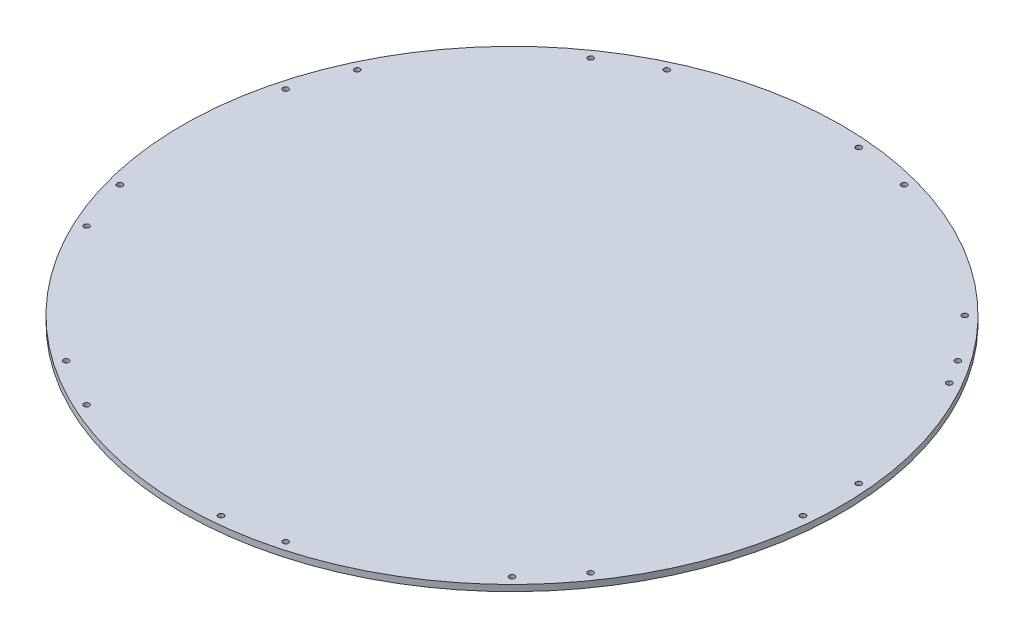
ISO-10303-21;
HEADER;
FILE_DESCRIPTION(('STEP AP214'),'2;1');
FILE_NAME('part.step','',(''),(''),'','','');
FILE_SCHEMA(('AUTOMOTIVE_DESIGN { 1 0 10303 214 1 1 1 1 }'));
ENDSEC;
DATA;
#1=APPLICATION_CONTEXT('core data for automotive mechanical design processes');
#2=APPLICATION_PROTOCOL_DEFINITION('international standard','automotive_design',2000,#1);
#3=PRODUCT_CONTEXT('',#1,'mechanical');
#4=PRODUCT('Part','Part','',(#3));
#5=PRODUCT_RELATED_PRODUCT_CATEGORY('part','',(#4));
#6=PRODUCT_DEFINITION_FORMATION('','',#4);
#7=PRODUCT_DEFINITION_CONTEXT('part definition',#1,'design');
#8=PRODUCT_DEFINITION('design','',#6,#7);
#9=PRODUCT_DEFINITION_SHAPE('','',#8);
#10=(LENGTH_UNIT() NAMED_UNIT(*) SI_UNIT(.MILLI.,.METRE.));
#11=(NAMED_UNIT(*) PLANE_ANGLE_UNIT() SI_UNIT($,.RADIAN.));
#12=(NAMED_UNIT(*) SI_UNIT($,.STERADIAN.) SOLID_ANGLE_UNIT());
#13=UNCERTAINTY_MEASURE_WITH_UNIT(LENGTH_MEASURE(1.E-05),#10,'distance_accuracy_value','');
#14=(GEOMETRIC_REPRESENTATION_CONTEXT(3) GLOBAL_UNCERTAINTY_ASSIGNED_CONTEXT((#13)) GLOBAL_UNIT_ASSIGNED_CONTEXT((#10,
#11,#12)) REPRESENTATION_CONTEXT('',''));
#15=CARTESIAN_POINT('',(0.,0.,0.));
#16=DIRECTION('',(0.,0.,1.));
#17=DIRECTION('',(1.,0.,0.));
#18=AXIS2_PLACEMENT_3D('',#15,#16,#17);
#19=CARTESIAN_POINT('',(0.,5.842,0.));
#20=DIRECTION('',(0.,-1.,0.));
#21=DIRECTION('',(0.,0.,-1.));
#22=AXIS2_PLACEMENT_3D('',#19,#20,#21);
#23=CYLINDRICAL_SURFACE('',#22,309.88);
#24=CARTESIAN_POINT('',(0.,5.842,0.));
#25=DIRECTION('',(0.,1.,0.));
#26=DIRECTION('',(0.,0.,1.));
#27=AXIS2_PLACEMENT_3D('',#24,#25,#26);
#28=CIRCLE('',#27,309.88);
#29=CARTESIAN_POINT('',(0.,5.842,309.88));
#30=VERTEX_POINT('',#29);
#31=EDGE_CURVE('E10',#30,#30,#28,.T.);
#32=ORIENTED_EDGE('',*,*,#31,.F.);
#33=EDGE_LOOP('',(#32));
#34=FACE_BOUND('',#33,.T.);
#35=CARTESIAN_POINT('',(0.,0.,0.));
#36=DIRECTION('',(0.,1.,0.));
#37=DIRECTION('',(0.,0.,1.));
#38=AXIS2_PLACEMENT_3D('',#35,#36,#37);
#39=CIRCLE('',#38,309.88);
#40=CARTESIAN_POINT('',(0.,0.,309.88));
#41=VERTEX_POINT('',#40);
#42=EDGE_CURVE('E33',#41,#41,#39,.T.);
#43=ORIENTED_EDGE('',*,*,#42,.T.);
#44=EDGE_LOOP('',(#43));
#45=FACE_BOUND('',#44,.T.);
#46=ADVANCED_FACE('F30',(#34,#45),#23,.T.);
#47=CARTESIAN_POINT('',(0.,5.842,0.));
#48=DIRECTION('',(0.,1.,0.));
#49=DIRECTION('',(0.,0.,1.));
#50=AXIS2_PLACEMENT_3D('',#47,#48,#49);
#51=PLANE('',#50);
#52=CARTESIAN_POINT('',(260.664986285079,5.842,-150.494999999999));
#53=DIRECTION('',(0.,1.,0.));
#54=DIRECTION('',(0.,0.,1.));
#55=AXIS2_PLACEMENT_3D('',#52,#53,#54);
#56=CIRCLE('',#55,2.55270000000004);
#57=CARTESIAN_POINT('',(260.664986285079,5.842,-147.942299999998));
#58=VERTEX_POINT('',#57);
#59=EDGE_CURVE('E150',#58,#58,#56,.T.);
#60=ORIENTED_EDGE('',*,*,#59,.F.);
#61=EDGE_LOOP('',(#60));
#62=FACE_BOUND('',#61,.T.);
#63=CARTESIAN_POINT('',(77.9019443854089,5.842,-290.734014454746));
#64=DIRECTION('',(0.,1.,0.));
#65=DIRECTION('',(-0.866025403784436,0.,-0.500000000000004));
#66=AXIS2_PLACEMENT_3D('',#63,#64,#65);
#67=CIRCLE('',#66,2.55270000000004);
#68=CARTESIAN_POINT('',(75.6912413371683,5.842,-292.010364454746));
#69=VERTEX_POINT('',#68);
#70=EDGE_CURVE('E91',#69,#69,#67,.T.);
#71=ORIENTED_EDGE('',*,*,#70,.F.);
#72=EDGE_LOOP('',(#71));
#73=FACE_BOUND('',#72,.T.);
#74=CARTESIAN_POINT('',(299.844642178635,5.842,-26.2330070096156));
#75=DIRECTION('',(0.,1.,0.));
#76=DIRECTION('',(-0.342020143325663,0.,-0.939692620785911));
#77=AXIS2_PLACEMENT_3D('',#74,#75,#76);
#78=CIRCLE('',#77,2.55270000000004);
#79=CARTESIAN_POINT('',(298.971567358767,5.842,-28.6317603626959));
#80=VERTEX_POINT('',#79);
#81=EDGE_CURVE('E84',#80,#80,#78,.T.);
#82=ORIENTED_EDGE('',*,*,#81,.F.);
#83=EDGE_LOOP('',(#82));
#84=FACE_BOUND('',#83,.T.);
#85=CARTESIAN_POINT('',(246.556573810545,5.842,-172.6407715773));
#86=DIRECTION('',(0.,1.,0.));
#87=DIRECTION('',(-0.342020143325663,0.,-0.939692620785911));
#88=AXIS2_PLACEMENT_3D('',#85,#86,#87);
#89=CIRCLE('',#88,2.55270000000004);
#90=CARTESIAN_POINT('',(245.683498990677,5.842,-175.03952493038));
#91=VERTEX_POINT('',#90);
#92=EDGE_CURVE('E103',#91,#91,#89,.T.);
#93=ORIENTED_EDGE('',*,*,#92,.F.);
#94=EDGE_LOOP('',(#93));
#95=FACE_BOUND('',#94,.T.);
#96=CARTESIAN_POINT('',(246.556573810542,5.842,172.640771577303));
#97=DIRECTION('',(0.,1.,0.));
#98=DIRECTION('',(0.342020143325676,0.,-0.939692620785906));
#99=AXIS2_PLACEMENT_3D('',#96,#97,#98);
#100=CIRCLE('',#99,2.55270000000004);
#101=CARTESIAN_POINT('',(247.42964863041,5.842,170.242018224223));
#102=VERTEX_POINT('',#101);
#103=EDGE_CURVE('E96',#102,#102,#100,.T.);
#104=ORIENTED_EDGE('',*,*,#103,.F.);
#105=EDGE_LOOP('',(#104));
#106=FACE_BOUND('',#105,.T.);
#107=CARTESIAN_POINT('',(-272.789580820161,5.842,-127.203870601333));
#108=DIRECTION('',(0.,1.,0.));
#109=DIRECTION('',(-0.642787609686541,0.,0.766044443118977));
#110=AXIS2_PLACEMENT_3D('',#107,#108,#109);
#111=CIRCLE('',#110,2.55270000000004);
#112=CARTESIAN_POINT('',(-274.430424751408,5.842,-125.248388951384));
#113=VERTEX_POINT('',#112);
#114=EDGE_CURVE('E67',#113,#113,#111,.T.);
#115=ORIENTED_EDGE('',*,*,#114,.F.);
#116=EDGE_LOOP('',(#115));
#117=FACE_BOUND('',#116,.T.);
#118=CARTESIAN_POINT('',(26.2330070096187,5.842,-299.844642178634));
#119=DIRECTION('',(0.,1.,0.));
#120=DIRECTION('',(-0.984807753012209,0.,0.173648177666927));
#121=AXIS2_PLACEMENT_3D('',#118,#119,#120);
#122=CIRCLE('',#121,2.55270000000004);
#123=CARTESIAN_POINT('',(23.7190882585044,5.842,-299.401370475504));
#124=VERTEX_POINT('',#123);
#125=EDGE_CURVE('E60',#124,#124,#122,.T.);
#126=ORIENTED_EDGE('',*,*,#125,.F.);
#127=EDGE_LOOP('',(#126));
#128=FACE_BOUND('',#127,.T.);
#129=CARTESIAN_POINT('',(-127.203870601332,5.842,-272.789580820162));
#130=DIRECTION('',(0.,1.,0.));
#131=DIRECTION('',(-0.984807753012209,0.,0.173648177666927));
#132=AXIS2_PLACEMENT_3D('',#129,#130,#131);
#133=CIRCLE('',#132,2.55270000000004);
#134=CARTESIAN_POINT('',(-129.717789352447,5.842,-272.346309117031));
#135=VERTEX_POINT('',#134);
#136=EDGE_CURVE('E79',#135,#135,#133,.T.);
#137=ORIENTED_EDGE('',*,*,#136,.F.);
#138=EDGE_LOOP('',(#137));
#139=FACE_BOUND('',#138,.T.);
#140=CARTESIAN_POINT('',(212.83207006934,5.842,-212.832070069338));
#141=DIRECTION('',(0.,1.,0.));
#142=DIRECTION('',(-0.866025403784436,0.,-0.500000000000004));
#143=AXIS2_PLACEMENT_3D('',#140,#141,#142);
#144=CIRCLE('',#143,2.55270000000004);
#145=CARTESIAN_POINT('',(210.6213670211,5.842,-214.108420069338));
#146=VERTEX_POINT('',#145);
#147=EDGE_CURVE('E72',#146,#146,#144,.T.);
#148=ORIENTED_EDGE('',*,*,#147,.F.);
#149=EDGE_LOOP('',(#148));
#150=FACE_BOUND('',#149,.T.);
#151=CARTESIAN_POINT('',(26.2330070096147,5.842,299.844642178635));
#152=DIRECTION('',(0.,1.,0.));
#153=DIRECTION('',(0.984807753012206,0.,0.17364817766694));
#154=AXIS2_PLACEMENT_3D('',#151,#152,#153);
#155=CIRCLE('',#154,2.55270000000004);
#156=CARTESIAN_POINT('',(28.746925760729,5.842,300.287913881765));
#157=VERTEX_POINT('',#156);
#158=EDGE_CURVE('E139',#157,#157,#155,.T.);
#159=ORIENTED_EDGE('',*,*,#158,.F.);
#160=EDGE_LOOP('',(#159));
#161=FACE_BOUND('',#160,.T.);
#162=CARTESIAN_POINT('',(-272.789580820163,5.842,127.20387060133));
#163=DIRECTION('',(0.,1.,0.));
#164=DIRECTION('',(0.64278760968653,0.,0.766044443118986));
#165=AXIS2_PLACEMENT_3D('',#162,#163,#164);
#166=CIRCLE('',#165,2.55270000000004);
#167=CARTESIAN_POINT('',(-271.148736888916,5.842,129.15935225128));
#168=VERTEX_POINT('',#167);
#169=EDGE_CURVE('E132',#168,#168,#166,.T.);
#170=ORIENTED_EDGE('',*,*,#169,.F.);
#171=EDGE_LOOP('',(#170));
#172=FACE_BOUND('',#171,.T.);
#173=CARTESIAN_POINT('',(-172.640771577304,5.842,246.556573810542));
#174=DIRECTION('',(0.,1.,0.));
#175=DIRECTION('',(0.64278760968653,0.,0.766044443118986));
#176=AXIS2_PLACEMENT_3D('',#173,#174,#175);
#177=CIRCLE('',#176,2.55270000000004);
#178=CARTESIAN_POINT('',(-170.999927646057,5.842,248.512055460492));
#179=VERTEX_POINT('',#178);
#180=EDGE_CURVE('E144',#179,#179,#177,.T.);
#181=ORIENTED_EDGE('',*,*,#180,.F.);
#182=EDGE_LOOP('',(#181));
#183=FACE_BOUND('',#182,.T.);
#184=CARTESIAN_POINT('',(299.844642178634,5.842,26.2330070096197));
#185=DIRECTION('',(0.,1.,0.));
#186=DIRECTION('',(0.342020143325676,0.,-0.939692620785906));
#187=AXIS2_PLACEMENT_3D('',#184,#185,#186);
#188=CIRCLE('',#187,2.55270000000004);
#189=CARTESIAN_POINT('',(300.717716998502,5.842,23.8342536565395));
#190=VERTEX_POINT('',#189);
#191=EDGE_CURVE('E115',#190,#190,#188,.T.);
#192=ORIENTED_EDGE('',*,*,#191,.F.);
#193=EDGE_LOOP('',(#192));
#194=FACE_BOUND('',#193,.T.);
#195=CARTESIAN_POINT('',(77.9019443854049,5.842,290.734014454747));
#196=DIRECTION('',(0.,1.,0.));
#197=DIRECTION('',(0.866025403784443,0.,-0.499999999999992));
#198=AXIS2_PLACEMENT_3D('',#195,#196,#197);
#199=CIRCLE('',#198,2.55270000000004);
#200=CARTESIAN_POINT('',(80.1126474336454,5.842,289.457664454747));
#201=VERTEX_POINT('',#200);
#202=EDGE_CURVE('E108',#201,#201,#199,.T.);
#203=ORIENTED_EDGE('',*,*,#202,.F.);
#204=EDGE_LOOP('',(#203));
#205=FACE_BOUND('',#204,.T.);
#206=CARTESIAN_POINT('',(212.832070069337,5.842,212.832070069341));
#207=DIRECTION('',(0.,1.,0.));
#208=DIRECTION('',(0.866025403784443,0.,-0.499999999999992));
#209=AXIS2_PLACEMENT_3D('',#206,#207,#208);
#210=CIRCLE('',#209,2.55270000000004);
#211=CARTESIAN_POINT('',(215.042773117578,5.842,211.555720069341));
#212=VERTEX_POINT('',#211);
#213=EDGE_CURVE('E127',#212,#212,#210,.T.);
#214=ORIENTED_EDGE('',*,*,#213,.F.);
#215=EDGE_LOOP('',(#214));
#216=FACE_BOUND('',#215,.T.);
#217=CARTESIAN_POINT('',(-127.203870601336,5.842,272.78958082016));
#218=DIRECTION('',(0.,1.,0.));
#219=DIRECTION('',(0.984807753012206,0.,0.17364817766694));
#220=AXIS2_PLACEMENT_3D('',#217,#218,#219);
#221=CIRCLE('',#220,2.55270000000004);
#222=CARTESIAN_POINT('',(-124.689951850222,5.842,273.23285252329));
#223=VERTEX_POINT('',#222);
#224=EDGE_CURVE('E120',#223,#223,#221,.T.);
#225=ORIENTED_EDGE('',*,*,#224,.F.);
#226=EDGE_LOOP('',(#225));
#227=FACE_BOUND('',#226,.T.);
#228=CARTESIAN_POINT('',(-172.640771577301,5.842,-246.556573810544));
#229=DIRECTION('',(0.,1.,0.));
#230=DIRECTION('',(-0.642787609686541,0.,0.766044443118977));
#231=AXIS2_PLACEMENT_3D('',#228,#229,#230);
#232=CIRCLE('',#231,2.55270000000004);
#233=CARTESIAN_POINT('',(-174.281615508548,5.842,-244.601092160594));
#234=VERTEX_POINT('',#233);
#235=EDGE_CURVE('E54',#234,#234,#232,.T.);
#236=ORIENTED_EDGE('',*,*,#235,.F.);
#237=EDGE_LOOP('',(#236));
#238=FACE_BOUND('',#237,.T.);
#239=CARTESIAN_POINT('',(-290.734014454747,5.842,-77.9019443854079));
#240=DIRECTION('',(0.,1.,0.));
#241=DIRECTION('',(0.,0.,1.));
#242=AXIS2_PLACEMENT_3D('',#239,#240,#241);
#243=CIRCLE('',#242,2.55270000000004);
#244=CARTESIAN_POINT('',(-290.734014454747,5.842,-75.3492443854079));
#245=VERTEX_POINT('',#244);
#246=EDGE_CURVE('E49',#245,#245,#243,.T.);
#247=ORIENTED_EDGE('',*,*,#246,.F.);
#248=EDGE_LOOP('',(#247));
#249=FACE_BOUND('',#248,.T.);
#250=CARTESIAN_POINT('',(-290.734014454747,5.842,77.9019443854079));
#251=DIRECTION('',(0.,1.,0.));
#252=DIRECTION('',(0.,0.,1.));
#253=AXIS2_PLACEMENT_3D('',#250,#251,#252);
#254=CIRCLE('',#253,2.55270000000004);
#255=CARTESIAN_POINT('',(-290.734014454747,5.842,80.4546443854079));
#256=VERTEX_POINT('',#255);
#257=EDGE_CURVE('E42',#256,#256,#254,.T.);
#258=ORIENTED_EDGE('',*,*,#257,.F.);
#259=EDGE_LOOP('',(#258));
#260=FACE_BOUND('',#259,.T.);
#261=ORIENTED_EDGE('',*,*,#31,.T.);
#262=EDGE_LOOP('',(#261));
#263=FACE_BOUND('',#262,.T.);
#264=ADVANCED_FACE('F166',(#62,#73,#84,#95,#106,#117,#128,#139,#150,#161,#172,#183,#194,#205,
#216,#227,#238,#249,#260,#263),#51,.T.);
#265=CARTESIAN_POINT('',(0.,0.,0.));
#266=DIRECTION('',(0.,1.,0.));
#267=DIRECTION('',(0.,0.,1.));
#268=AXIS2_PLACEMENT_3D('',#265,#266,#267);
#269=PLANE('',#268);
#270=CARTESIAN_POINT('',(260.664986285079,0.,-150.494999999999));
#271=DIRECTION('',(0.,1.,0.));
#272=DIRECTION('',(0.,0.,1.));
#273=AXIS2_PLACEMENT_3D('',#270,#271,#272);
#274=CIRCLE('',#273,2.55270000000004);
#275=CARTESIAN_POINT('',(260.664986285079,0.,-147.942299999998));
#276=VERTEX_POINT('',#275);
#277=EDGE_CURVE('E147',#276,#276,#274,.T.);
#278=ORIENTED_EDGE('',*,*,#277,.T.);
#279=EDGE_LOOP('',(#278));
#280=FACE_BOUND('',#279,.T.);
#281=CARTESIAN_POINT('',(77.9019443854089,0.,-290.734014454746));
#282=DIRECTION('',(0.,1.,0.));
#283=DIRECTION('',(-0.866025403784436,0.,-0.500000000000004));
#284=AXIS2_PLACEMENT_3D('',#281,#282,#283);
#285=CIRCLE('',#284,2.55270000000004);
#286=CARTESIAN_POINT('',(75.6912413371683,0.,-292.010364454746));
#287=VERTEX_POINT('',#286);
#288=EDGE_CURVE('E76',#287,#287,#285,.T.);
#289=ORIENTED_EDGE('',*,*,#288,.T.);
#290=EDGE_LOOP('',(#289));
#291=FACE_BOUND('',#290,.T.);
#292=CARTESIAN_POINT('',(299.844642178635,0.,-26.2330070096156));
#293=DIRECTION('',(0.,1.,0.));
#294=DIRECTION('',(-0.342020143325663,0.,-0.939692620785911));
#295=AXIS2_PLACEMENT_3D('',#292,#293,#294);
#296=CIRCLE('',#295,2.55270000000004);
#297=CARTESIAN_POINT('',(298.971567358767,0.,-28.6317603626959));
#298=VERTEX_POINT('',#297);
#299=EDGE_CURVE('E87',#298,#298,#296,.T.);
#300=ORIENTED_EDGE('',*,*,#299,.T.);
#301=EDGE_LOOP('',(#300));
#302=FACE_BOUND('',#301,.T.);
#303=CARTESIAN_POINT('',(246.556573810545,0.,-172.6407715773));
#304=DIRECTION('',(0.,1.,0.));
#305=DIRECTION('',(-0.342020143325663,0.,-0.939692620785911));
#306=AXIS2_PLACEMENT_3D('',#303,#304,#305);
#307=CIRCLE('',#306,2.55270000000004);
#308=CARTESIAN_POINT('',(245.683498990677,0.,-175.03952493038));
#309=VERTEX_POINT('',#308);
#310=EDGE_CURVE('E88',#309,#309,#307,.T.);
#311=ORIENTED_EDGE('',*,*,#310,.T.);
#312=EDGE_LOOP('',(#311));
#313=FACE_BOUND('',#312,.T.);
#314=CARTESIAN_POINT('',(246.556573810542,0.,172.640771577303));
#315=DIRECTION('',(0.,1.,0.));
#316=DIRECTION('',(0.342020143325676,0.,-0.939692620785906));
#317=AXIS2_PLACEMENT_3D('',#314,#315,#316);
#318=CIRCLE('',#317,2.55270000000004);
#319=CARTESIAN_POINT('',(247.42964863041,0.,170.242018224223));
#320=VERTEX_POINT('',#319);
#321=EDGE_CURVE('E99',#320,#320,#318,.T.);
#322=ORIENTED_EDGE('',*,*,#321,.T.);
#323=EDGE_LOOP('',(#322));
#324=FACE_BOUND('',#323,.T.);
#325=CARTESIAN_POINT('',(-272.789580820161,0.,-127.203870601333));
#326=DIRECTION('',(0.,1.,0.));
#327=DIRECTION('',(-0.642787609686541,0.,0.766044443118977));
#328=AXIS2_PLACEMENT_3D('',#325,#326,#327);
#329=CIRCLE('',#328,2.55270000000004);
#330=CARTESIAN_POINT('',(-274.430424751408,0.,-125.248388951384));
#331=VERTEX_POINT('',#330);
#332=EDGE_CURVE('E57',#331,#331,#329,.T.);
#333=ORIENTED_EDGE('',*,*,#332,.T.);
#334=EDGE_LOOP('',(#333));
#335=FACE_BOUND('',#334,.T.);
#336=CARTESIAN_POINT('',(26.2330070096187,0.,-299.844642178634));
#337=DIRECTION('',(0.,1.,0.));
#338=DIRECTION('',(-0.984807753012209,0.,0.173648177666927));
#339=AXIS2_PLACEMENT_3D('',#336,#337,#338);
#340=CIRCLE('',#339,2.55270000000004);
#341=CARTESIAN_POINT('',(23.7190882585044,0.,-299.401370475504));
#342=VERTEX_POINT('',#341);
#343=EDGE_CURVE('E63',#342,#342,#340,.T.);
#344=ORIENTED_EDGE('',*,*,#343,.T.);
#345=EDGE_LOOP('',(#344));
#346=FACE_BOUND('',#345,.T.);
#347=CARTESIAN_POINT('',(-127.203870601332,0.,-272.789580820162));
#348=DIRECTION('',(0.,1.,0.));
#349=DIRECTION('',(-0.984807753012209,0.,0.173648177666927));
#350=AXIS2_PLACEMENT_3D('',#347,#348,#349);
#351=CIRCLE('',#350,2.55270000000004);
#352=CARTESIAN_POINT('',(-129.717789352447,0.,-272.346309117031));
#353=VERTEX_POINT('',#352);
#354=EDGE_CURVE('E64',#353,#353,#351,.T.);
#355=ORIENTED_EDGE('',*,*,#354,.T.);
#356=EDGE_LOOP('',(#355));
#357=FACE_BOUND('',#356,.T.);
#358=CARTESIAN_POINT('',(212.83207006934,0.,-212.832070069338));
#359=DIRECTION('',(0.,1.,0.));
#360=DIRECTION('',(-0.866025403784436,0.,-0.500000000000004));
#361=AXIS2_PLACEMENT_3D('',#358,#359,#360);
#362=CIRCLE('',#361,2.55270000000004);
#363=CARTESIAN_POINT('',(210.6213670211,0.,-214.108420069338));
#364=VERTEX_POINT('',#363);
#365=EDGE_CURVE('E75',#364,#364,#362,.T.);
#366=ORIENTED_EDGE('',*,*,#365,.T.);
#367=EDGE_LOOP('',(#366));
#368=FACE_BOUND('',#367,.T.);
#369=CARTESIAN_POINT('',(26.2330070096147,0.,299.844642178635));
#370=DIRECTION('',(0.,1.,0.));
#371=DIRECTION('',(0.984807753012206,0.,0.17364817766694));
#372=AXIS2_PLACEMENT_3D('',#369,#370,#371);
#373=CIRCLE('',#372,2.55270000000004);
#374=CARTESIAN_POINT('',(28.746925760729,0.,300.287913881765));
#375=VERTEX_POINT('',#374);
#376=EDGE_CURVE('E124',#375,#375,#373,.T.);
#377=ORIENTED_EDGE('',*,*,#376,.T.);
#378=EDGE_LOOP('',(#377));
#379=FACE_BOUND('',#378,.T.);
#380=CARTESIAN_POINT('',(-272.789580820163,0.,127.20387060133));
#381=DIRECTION('',(0.,1.,0.));
#382=DIRECTION('',(0.64278760968653,0.,0.766044443118986));
#383=AXIS2_PLACEMENT_3D('',#380,#381,#382);
#384=CIRCLE('',#383,2.55270000000004);
#385=CARTESIAN_POINT('',(-271.148736888916,0.,129.15935225128));
#386=VERTEX_POINT('',#385);
#387=EDGE_CURVE('E135',#386,#386,#384,.T.);
#388=ORIENTED_EDGE('',*,*,#387,.T.);
#389=EDGE_LOOP('',(#388));
#390=FACE_BOUND('',#389,.T.);
#391=CARTESIAN_POINT('',(-172.640771577304,0.,246.556573810542));
#392=DIRECTION('',(0.,1.,0.));
#393=DIRECTION('',(0.64278760968653,0.,0.766044443118986));
#394=AXIS2_PLACEMENT_3D('',#391,#392,#393);
#395=CIRCLE('',#394,2.55270000000004);
#396=CARTESIAN_POINT('',(-170.999927646057,0.,248.512055460492));
#397=VERTEX_POINT('',#396);
#398=EDGE_CURVE('E136',#397,#397,#395,.T.);
#399=ORIENTED_EDGE('',*,*,#398,.T.);
#400=EDGE_LOOP('',(#399));
#401=FACE_BOUND('',#400,.T.);
#402=CARTESIAN_POINT('',(299.844642178634,0.,26.2330070096197));
#403=DIRECTION('',(0.,1.,0.));
#404=DIRECTION('',(0.342020143325676,0.,-0.939692620785906));
#405=AXIS2_PLACEMENT_3D('',#402,#403,#404);
#406=CIRCLE('',#405,2.55270000000004);
#407=CARTESIAN_POINT('',(300.717716998502,0.,23.8342536565395));
#408=VERTEX_POINT('',#407);
#409=EDGE_CURVE('E100',#408,#408,#406,.T.);
#410=ORIENTED_EDGE('',*,*,#409,.T.);
#411=EDGE_LOOP('',(#410));
#412=FACE_BOUND('',#411,.T.);
#413=CARTESIAN_POINT('',(77.9019443854049,0.,290.734014454747));
#414=DIRECTION('',(0.,1.,0.));
#415=DIRECTION('',(0.866025403784443,0.,-0.499999999999992));
#416=AXIS2_PLACEMENT_3D('',#413,#414,#415);
#417=CIRCLE('',#416,2.55270000000004);
#418=CARTESIAN_POINT('',(80.1126474336454,0.,289.457664454747));
#419=VERTEX_POINT('',#418);
#420=EDGE_CURVE('E111',#419,#419,#417,.T.);
#421=ORIENTED_EDGE('',*,*,#420,.T.);
#422=EDGE_LOOP('',(#421));
#423=FACE_BOUND('',#422,.T.);
#424=CARTESIAN_POINT('',(212.832070069337,0.,212.832070069341));
#425=DIRECTION('',(0.,1.,0.));
#426=DIRECTION('',(0.866025403784443,0.,-0.499999999999992));
#427=AXIS2_PLACEMENT_3D('',#424,#425,#426);
#428=CIRCLE('',#427,2.55270000000004);
#429=CARTESIAN_POINT('',(215.042773117578,0.,211.555720069341));
#430=VERTEX_POINT('',#429);
#431=EDGE_CURVE('E112',#430,#430,#428,.T.);
#432=ORIENTED_EDGE('',*,*,#431,.T.);
#433=EDGE_LOOP('',(#432));
#434=FACE_BOUND('',#433,.T.);
#435=CARTESIAN_POINT('',(-127.203870601336,0.,272.78958082016));
#436=DIRECTION('',(0.,1.,0.));
#437=DIRECTION('',(0.984807753012206,0.,0.17364817766694));
#438=AXIS2_PLACEMENT_3D('',#435,#436,#437);
#439=CIRCLE('',#438,2.55270000000004);
#440=CARTESIAN_POINT('',(-124.689951850222,0.,273.23285252329));
#441=VERTEX_POINT('',#440);
#442=EDGE_CURVE('E123',#441,#441,#439,.T.);
#443=ORIENTED_EDGE('',*,*,#442,.T.);
#444=EDGE_LOOP('',(#443));
#445=FACE_BOUND('',#444,.T.);
#446=CARTESIAN_POINT('',(-172.640771577301,0.,-246.556573810544));
#447=DIRECTION('',(0.,1.,0.));
#448=DIRECTION('',(-0.642787609686541,0.,0.766044443118977));
#449=AXIS2_PLACEMENT_3D('',#446,#447,#448);
#450=CIRCLE('',#449,2.55270000000004);
#451=CARTESIAN_POINT('',(-174.281615508548,0.,-244.601092160594));
#452=VERTEX_POINT('',#451);
#453=EDGE_CURVE('E46',#452,#452,#450,.T.);
#454=ORIENTED_EDGE('',*,*,#453,.T.);
#455=EDGE_LOOP('',(#454));
#456=FACE_BOUND('',#455,.T.);
#457=CARTESIAN_POINT('',(-290.734014454747,0.,-77.9019443854079));
#458=DIRECTION('',(0.,1.,0.));
#459=DIRECTION('',(0.,0.,1.));
#460=AXIS2_PLACEMENT_3D('',#457,#458,#459);
#461=CIRCLE('',#460,2.55270000000004);
#462=CARTESIAN_POINT('',(-290.734014454747,0.,-75.3492443854079));
#463=VERTEX_POINT('',#462);
#464=EDGE_CURVE('E40',#463,#463,#461,.T.);
#465=ORIENTED_EDGE('',*,*,#464,.T.);
#466=EDGE_LOOP('',(#465));
#467=FACE_BOUND('',#466,.T.);
#468=CARTESIAN_POINT('',(-290.734014454747,0.,77.9019443854079));
#469=DIRECTION('',(0.,1.,0.));
#470=DIRECTION('',(0.,0.,1.));
#471=AXIS2_PLACEMENT_3D('',#468,#469,#470);
#472=CIRCLE('',#471,2.55270000000004);
#473=CARTESIAN_POINT('',(-290.734014454747,0.,80.4546443854079));
#474=VERTEX_POINT('',#473);
#475=EDGE_CURVE('E45',#474,#474,#472,.T.);
#476=ORIENTED_EDGE('',*,*,#475,.T.);
#477=EDGE_LOOP('',(#476));
#478=FACE_BOUND('',#477,.T.);
#479=ORIENTED_EDGE('',*,*,#42,.F.);
#480=EDGE_LOOP('',(#479));
#481=FACE_BOUND('',#480,.T.);
#482=ADVANCED_FACE('F156',(#280,#291,#302,#313,#324,#335,#346,#357,#368,#379,#390,#401,#412,
#423,#434,#445,#456,#467,#478,#481),#269,.F.);
#483=CARTESIAN_POINT('',(-290.734014454747,0.,77.9019443854079));
#484=DIRECTION('',(0.,1.,0.));
#485=DIRECTION('',(0.,0.,1.));
#486=AXIS2_PLACEMENT_3D('',#483,#484,#485);
#487=CYLINDRICAL_SURFACE('',#486,2.55270000000004);
#488=ORIENTED_EDGE('',*,*,#475,.F.);
#489=EDGE_LOOP('',(#488));
#490=FACE_BOUND('',#489,.T.);
#491=ORIENTED_EDGE('',*,*,#257,.T.);
#492=EDGE_LOOP('',(#491));
#493=FACE_BOUND('',#492,.T.);
#494=ADVANCED_FACE('F206',(#490,#493),#487,.F.);
#495=CARTESIAN_POINT('',(-290.734014454747,0.,-77.9019443854079));
#496=DIRECTION('',(0.,1.,0.));
#497=DIRECTION('',(0.,0.,1.));
#498=AXIS2_PLACEMENT_3D('',#495,#496,#497);
#499=CYLINDRICAL_SURFACE('',#498,2.55270000000004);
#500=ORIENTED_EDGE('',*,*,#464,.F.);
#501=EDGE_LOOP('',(#500));
#502=FACE_BOUND('',#501,.T.);
#503=ORIENTED_EDGE('',*,*,#246,.T.);
#504=EDGE_LOOP('',(#503));
#505=FACE_BOUND('',#504,.T.);
#506=ADVANCED_FACE('F208',(#502,#505),#499,.F.);
#507=CARTESIAN_POINT('',(-172.640771577301,0.,-246.556573810544));
#508=DIRECTION('',(0.,1.,0.));
#509=DIRECTION('',(0.,0.,1.));
#510=AXIS2_PLACEMENT_3D('',#507,#508,#509);
#511=CYLINDRICAL_SURFACE('',#510,2.55270000000004);
#512=ORIENTED_EDGE('',*,*,#453,.F.);
#513=EDGE_LOOP('',(#512));
#514=FACE_BOUND('',#513,.T.);
#515=ORIENTED_EDGE('',*,*,#235,.T.);
#516=EDGE_LOOP('',(#515));
#517=FACE_BOUND('',#516,.T.);
#518=ADVANCED_FACE('F215',(#514,#517),#511,.F.);
#519=CARTESIAN_POINT('',(-127.203870601336,0.,272.78958082016));
#520=DIRECTION('',(0.,1.,0.));
#521=DIRECTION('',(0.,0.,1.));
#522=AXIS2_PLACEMENT_3D('',#519,#520,#521);
#523=CYLINDRICAL_SURFACE('',#522,2.55270000000004);
#524=ORIENTED_EDGE('',*,*,#442,.F.);
#525=EDGE_LOOP('',(#524));
#526=FACE_BOUND('',#525,.T.);
#527=ORIENTED_EDGE('',*,*,#224,.T.);
#528=EDGE_LOOP('',(#527));
#529=FACE_BOUND('',#528,.T.);
#530=ADVANCED_FACE('F353',(#526,#529),#523,.F.);
#531=CARTESIAN_POINT('',(212.832070069337,0.,212.832070069341));
#532=DIRECTION('',(0.,1.,0.));
#533=DIRECTION('',(0.,0.,1.));
#534=AXIS2_PLACEMENT_3D('',#531,#532,#533);
#535=CYLINDRICAL_SURFACE('',#534,2.55270000000004);
#536=ORIENTED_EDGE('',*,*,#431,.F.);
#537=EDGE_LOOP('',(#536));
#538=FACE_BOUND('',#537,.T.);
#539=ORIENTED_EDGE('',*,*,#213,.T.);
#540=EDGE_LOOP('',(#539));
#541=FACE_BOUND('',#540,.T.);
#542=ADVANCED_FACE('F345',(#538,#541),#535,.F.);
#543=CARTESIAN_POINT('',(77.9019443854049,0.,290.734014454747));
#544=DIRECTION('',(0.,1.,0.));
#545=DIRECTION('',(0.,0.,1.));
#546=AXIS2_PLACEMENT_3D('',#543,#544,#545);
#547=CYLINDRICAL_SURFACE('',#546,2.55270000000004);
#548=ORIENTED_EDGE('',*,*,#420,.F.);
#549=EDGE_LOOP('',(#548));
#550=FACE_BOUND('',#549,.T.);
#551=ORIENTED_EDGE('',*,*,#202,.T.);
#552=EDGE_LOOP('',(#551));
#553=FACE_BOUND('',#552,.T.);
#554=ADVANCED_FACE('F337',(#550,#553),#547,.F.);
#555=CARTESIAN_POINT('',(299.844642178634,0.,26.2330070096197));
#556=DIRECTION('',(0.,1.,0.));
#557=DIRECTION('',(0.,0.,1.));
#558=AXIS2_PLACEMENT_3D('',#555,#556,#557);
#559=CYLINDRICAL_SURFACE('',#558,2.55270000000004);
#560=ORIENTED_EDGE('',*,*,#409,.F.);
#561=EDGE_LOOP('',(#560));
#562=FACE_BOUND('',#561,.T.);
#563=ORIENTED_EDGE('',*,*,#191,.T.);
#564=EDGE_LOOP('',(#563));
#565=FACE_BOUND('',#564,.T.);
#566=ADVANCED_FACE('F329',(#562,#565),#559,.F.);
#567=CARTESIAN_POINT('',(-172.640771577304,0.,246.556573810542));
#568=DIRECTION('',(0.,1.,0.));
#569=DIRECTION('',(0.,0.,1.));
#570=AXIS2_PLACEMENT_3D('',#567,#568,#569);
#571=CYLINDRICAL_SURFACE('',#570,2.55270000000004);
#572=ORIENTED_EDGE('',*,*,#398,.F.);
#573=EDGE_LOOP('',(#572));
#574=FACE_BOUND('',#573,.T.);
#575=ORIENTED_EDGE('',*,*,#180,.T.);
#576=EDGE_LOOP('',(#575));
#577=FACE_BOUND('',#576,.T.);
#578=ADVANCED_FACE('F321',(#574,#577),#571,.F.);
#579=CARTESIAN_POINT('',(-272.789580820163,0.,127.20387060133));
#580=DIRECTION('',(0.,1.,0.));
#581=DIRECTION('',(0.,0.,1.));
#582=AXIS2_PLACEMENT_3D('',#579,#580,#581);
#583=CYLINDRICAL_SURFACE('',#582,2.55270000000004);
#584=ORIENTED_EDGE('',*,*,#387,.F.);
#585=EDGE_LOOP('',(#584));
#586=FACE_BOUND('',#585,.T.);
#587=ORIENTED_EDGE('',*,*,#169,.T.);
#588=EDGE_LOOP('',(#587));
#589=FACE_BOUND('',#588,.T.);
#590=ADVANCED_FACE('F313',(#586,#589),#583,.F.);
#591=CARTESIAN_POINT('',(26.2330070096147,0.,299.844642178635));
#592=DIRECTION('',(0.,1.,0.));
#593=DIRECTION('',(0.,0.,1.));
#594=AXIS2_PLACEMENT_3D('',#591,#592,#593);
#595=CYLINDRICAL_SURFACE('',#594,2.55270000000004);
#596=ORIENTED_EDGE('',*,*,#376,.F.);
#597=EDGE_LOOP('',(#596));
#598=FACE_BOUND('',#597,.T.);
#599=ORIENTED_EDGE('',*,*,#158,.T.);
#600=EDGE_LOOP('',(#599));
#601=FACE_BOUND('',#600,.T.);
#602=ADVANCED_FACE('F305',(#598,#601),#595,.F.);
#603=CARTESIAN_POINT('',(212.83207006934,0.,-212.832070069338));
#604=DIRECTION('',(0.,1.,0.));
#605=DIRECTION('',(0.,0.,1.));
#606=AXIS2_PLACEMENT_3D('',#603,#604,#605);
#607=CYLINDRICAL_SURFACE('',#606,2.55270000000004);
#608=ORIENTED_EDGE('',*,*,#365,.F.);
#609=EDGE_LOOP('',(#608));
#610=FACE_BOUND('',#609,.T.);
#611=ORIENTED_EDGE('',*,*,#147,.T.);
#612=EDGE_LOOP('',(#611));
#613=FACE_BOUND('',#612,.T.);
#614=ADVANCED_FACE('F297',(#610,#613),#607,.F.);
#615=CARTESIAN_POINT('',(-127.203870601332,0.,-272.789580820162));
#616=DIRECTION('',(0.,1.,0.));
#617=DIRECTION('',(0.,0.,1.));
#618=AXIS2_PLACEMENT_3D('',#615,#616,#617);
#619=CYLINDRICAL_SURFACE('',#618,2.55270000000004);
#620=ORIENTED_EDGE('',*,*,#354,.F.);
#621=EDGE_LOOP('',(#620));
#622=FACE_BOUND('',#621,.T.);
#623=ORIENTED_EDGE('',*,*,#136,.T.);
#624=EDGE_LOOP('',(#623));
#625=FACE_BOUND('',#624,.T.);
#626=ADVANCED_FACE('F289',(#622,#625),#619,.F.);
#627=CARTESIAN_POINT('',(26.2330070096187,0.,-299.844642178634));
#628=DIRECTION('',(0.,1.,0.));
#629=DIRECTION('',(0.,0.,1.));
#630=AXIS2_PLACEMENT_3D('',#627,#628,#629);
#631=CYLINDRICAL_SURFACE('',#630,2.55270000000004);
#632=ORIENTED_EDGE('',*,*,#343,.F.);
#633=EDGE_LOOP('',(#632));
#634=FACE_BOUND('',#633,.T.);
#635=ORIENTED_EDGE('',*,*,#125,.T.);
#636=EDGE_LOOP('',(#635));
#637=FACE_BOUND('',#636,.T.);
#638=ADVANCED_FACE('F281',(#634,#637),#631,.F.);
#639=CARTESIAN_POINT('',(-272.789580820161,0.,-127.203870601333));
#640=DIRECTION('',(0.,1.,0.));
#641=DIRECTION('',(0.,0.,1.));
#642=AXIS2_PLACEMENT_3D('',#639,#640,#641);
#643=CYLINDRICAL_SURFACE('',#642,2.55270000000004);
#644=ORIENTED_EDGE('',*,*,#332,.F.);
#645=EDGE_LOOP('',(#644));
#646=FACE_BOUND('',#645,.T.);
#647=ORIENTED_EDGE('',*,*,#114,.T.);
#648=EDGE_LOOP('',(#647));
#649=FACE_BOUND('',#648,.T.);
#650=ADVANCED_FACE('F273',(#646,#649),#643,.F.);
#651=CARTESIAN_POINT('',(246.556573810542,0.,172.640771577303));
#652=DIRECTION('',(0.,1.,0.));
#653=DIRECTION('',(0.,0.,1.));
#654=AXIS2_PLACEMENT_3D('',#651,#652,#653);
#655=CYLINDRICAL_SURFACE('',#654,2.55270000000004);
#656=ORIENTED_EDGE('',*,*,#321,.F.);
#657=EDGE_LOOP('',(#656));
#658=FACE_BOUND('',#657,.T.);
#659=ORIENTED_EDGE('',*,*,#103,.T.);
#660=EDGE_LOOP('',(#659));
#661=FACE_BOUND('',#660,.T.);
#662=ADVANCED_FACE('F265',(#658,#661),#655,.F.);
#663=CARTESIAN_POINT('',(246.556573810545,0.,-172.6407715773));
#664=DIRECTION('',(0.,1.,0.));
#665=DIRECTION('',(0.,0.,1.));
#666=AXIS2_PLACEMENT_3D('',#663,#664,#665);
#667=CYLINDRICAL_SURFACE('',#666,2.55270000000004);
#668=ORIENTED_EDGE('',*,*,#310,.F.);
#669=EDGE_LOOP('',(#668));
#670=FACE_BOUND('',#669,.T.);
#671=ORIENTED_EDGE('',*,*,#92,.T.);
#672=EDGE_LOOP('',(#671));
#673=FACE_BOUND('',#672,.T.);
#674=ADVANCED_FACE('F257',(#670,#673),#667,.F.);
#675=CARTESIAN_POINT('',(299.844642178635,0.,-26.2330070096156));
#676=DIRECTION('',(0.,1.,0.));
#677=DIRECTION('',(0.,0.,1.));
#678=AXIS2_PLACEMENT_3D('',#675,#676,#677);
#679=CYLINDRICAL_SURFACE('',#678,2.55270000000004);
#680=ORIENTED_EDGE('',*,*,#299,.F.);
#681=EDGE_LOOP('',(#680));
#682=FACE_BOUND('',#681,.T.);
#683=ORIENTED_EDGE('',*,*,#81,.T.);
#684=EDGE_LOOP('',(#683));
#685=FACE_BOUND('',#684,.T.);
#686=ADVANCED_FACE('F250',(#682,#685),#679,.F.);
#687=CARTESIAN_POINT('',(77.9019443854089,0.,-290.734014454746));
#688=DIRECTION('',(0.,1.,0.));
#689=DIRECTION('',(0.,0.,1.));
#690=AXIS2_PLACEMENT_3D('',#687,#688,#689);
#691=CYLINDRICAL_SURFACE('',#690,2.55270000000004);
#692=ORIENTED_EDGE('',*,*,#288,.F.);
#693=EDGE_LOOP('',(#692));
#694=FACE_BOUND('',#693,.T.);
#695=ORIENTED_EDGE('',*,*,#70,.T.);
#696=EDGE_LOOP('',(#695));
#697=FACE_BOUND('',#696,.T.);
#698=ADVANCED_FACE('F162',(#694,#697),#691,.F.);
#699=CARTESIAN_POINT('',(260.664986285079,0.,-150.494999999999));
#700=DIRECTION('',(0.,1.,0.));
#701=DIRECTION('',(0.,0.,1.));
#702=AXIS2_PLACEMENT_3D('',#699,#700,#701);
#703=CYLINDRICAL_SURFACE('',#702,2.55270000000004);
#704=ORIENTED_EDGE('',*,*,#277,.F.);
#705=EDGE_LOOP('',(#704));
#706=FACE_BOUND('',#705,.T.);
#707=ORIENTED_EDGE('',*,*,#59,.T.);
#708=EDGE_LOOP('',(#707));
#709=FACE_BOUND('',#708,.T.);
#710=ADVANCED_FACE('F159',(#706,#709),#703,.F.);
#711=CLOSED_SHELL('',(#46,#264,#482,#494,#506,#518,#530,#542,#554,#566,#578,#590,#602,#614,#626,
#638,#650,#662,#674,#686,#698,#710));
#712=MANIFOLD_SOLID_BREP('B2',#711);
#713=ADVANCED_BREP_SHAPE_REPRESENTATION('',(#18,#712),#14);
#714=SHAPE_DEFINITION_REPRESENTATION(#9,#713);
ENDSEC;
END-ISO-10303-21;
